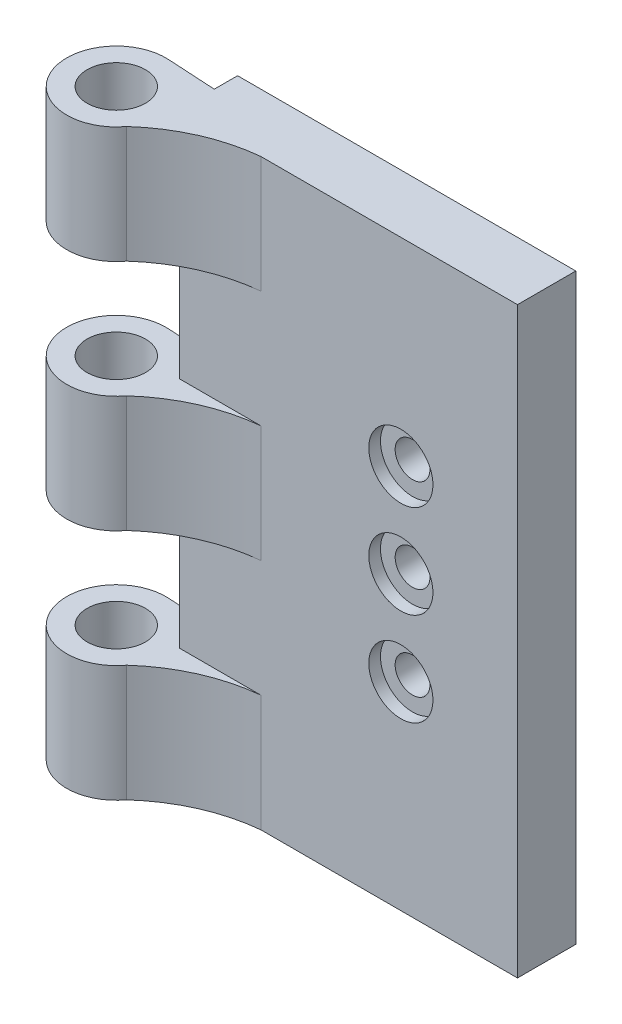
ISO-10303-21;
HEADER;
FILE_DESCRIPTION(('STEP AP214'),'2;1');
FILE_NAME('part.step','',(''),(''),'','','');
FILE_SCHEMA(('AUTOMOTIVE_DESIGN { 1 0 10303 214 1 1 1 1 }'));
ENDSEC;
DATA;
#1=APPLICATION_CONTEXT('core data for automotive mechanical design processes');
#2=APPLICATION_PROTOCOL_DEFINITION('international standard','automotive_design',2000,#1);
#3=PRODUCT_CONTEXT('',#1,'mechanical');
#4=PRODUCT('Part','Part','',(#3));
#5=PRODUCT_RELATED_PRODUCT_CATEGORY('part','',(#4));
#6=PRODUCT_DEFINITION_FORMATION('','',#4);
#7=PRODUCT_DEFINITION_CONTEXT('part definition',#1,'design');
#8=PRODUCT_DEFINITION('design','',#6,#7);
#9=PRODUCT_DEFINITION_SHAPE('','',#8);
#10=(LENGTH_UNIT() NAMED_UNIT(*) SI_UNIT(.MILLI.,.METRE.));
#11=(NAMED_UNIT(*) PLANE_ANGLE_UNIT() SI_UNIT($,.RADIAN.));
#12=(NAMED_UNIT(*) SI_UNIT($,.STERADIAN.) SOLID_ANGLE_UNIT());
#13=UNCERTAINTY_MEASURE_WITH_UNIT(LENGTH_MEASURE(1.E-05),#10,'distance_accuracy_value','');
#14=(GEOMETRIC_REPRESENTATION_CONTEXT(3) GLOBAL_UNCERTAINTY_ASSIGNED_CONTEXT((#13)) GLOBAL_UNIT_ASSIGNED_CONTEXT((#10,
#11,#12)) REPRESENTATION_CONTEXT('',''));
#15=CARTESIAN_POINT('',(0.,0.,0.));
#16=DIRECTION('',(0.,0.,1.));
#17=DIRECTION('',(1.,0.,0.));
#18=AXIS2_PLACEMENT_3D('',#15,#16,#17);
#19=CARTESIAN_POINT('',(27.5,-50.,0.));
#20=DIRECTION('',(0.,0.,-1.));
#21=DIRECTION('',(1.,0.,0.));
#22=AXIS2_PLACEMENT_3D('',#19,#20,#21);
#23=PLANE('',#22);
#24=CARTESIAN_POINT('',(29.,-33.,0.));
#25=DIRECTION('',(0.,0.,1.));
#26=DIRECTION('',(1.,0.,0.));
#27=AXIS2_PLACEMENT_3D('',#24,#25,#26);
#28=CIRCLE('',#27,2.75);
#29=CARTESIAN_POINT('',(31.75,-33.,0.));
#30=VERTEX_POINT('',#29);
#31=EDGE_CURVE('E10',#30,#30,#28,.T.);
#32=ORIENTED_EDGE('',*,*,#31,.F.);
#33=EDGE_LOOP('',(#32));
#34=FACE_BOUND('',#33,.T.);
#35=CARTESIAN_POINT('',(29.,-25.,0.));
#36=DIRECTION('',(0.,0.,1.));
#37=DIRECTION('',(1.,0.,0.));
#38=AXIS2_PLACEMENT_3D('',#35,#36,#37);
#39=CIRCLE('',#38,2.75);
#40=CARTESIAN_POINT('',(31.75,-25.,0.));
#41=VERTEX_POINT('',#40);
#42=EDGE_CURVE('E23',#41,#41,#39,.T.);
#43=ORIENTED_EDGE('',*,*,#42,.F.);
#44=EDGE_LOOP('',(#43));
#45=FACE_BOUND('',#44,.T.);
#46=CARTESIAN_POINT('',(29.,-17.,0.));
#47=DIRECTION('',(0.,0.,1.));
#48=DIRECTION('',(1.,0.,0.));
#49=AXIS2_PLACEMENT_3D('',#46,#47,#48);
#50=CIRCLE('',#49,2.75);
#51=CARTESIAN_POINT('',(31.75,-17.,0.));
#52=VERTEX_POINT('',#51);
#53=EDGE_CURVE('E284',#52,#52,#50,.T.);
#54=ORIENTED_EDGE('',*,*,#53,.F.);
#55=EDGE_LOOP('',(#54));
#56=FACE_BOUND('',#55,.T.);
#57=DIRECTION('',(0.,-1.,0.));
#58=VECTOR('',#57,1.);
#59=CARTESIAN_POINT('',(39.,-25.,0.));
#60=LINE('',#59,#58);
#61=CARTESIAN_POINT('',(39.,0.,0.));
#62=VERTEX_POINT('',#61);
#63=CARTESIAN_POINT('',(39.,-50.,0.));
#64=VERTEX_POINT('',#63);
#65=EDGE_CURVE('E30',#62,#64,#60,.T.);
#66=ORIENTED_EDGE('',*,*,#65,.F.);
#67=DIRECTION('',(1.,0.,0.));
#68=VECTOR('',#67,1.);
#69=CARTESIAN_POINT('',(27.5,0.,0.));
#70=LINE('',#69,#68);
#71=CARTESIAN_POINT('',(17.,0.,0.));
#72=VERTEX_POINT('',#71);
#73=EDGE_CURVE('E34',#72,#62,#70,.T.);
#74=ORIENTED_EDGE('',*,*,#73,.F.);
#75=DIRECTION('',(0.,-1.,0.));
#76=VECTOR('',#75,1.);
#77=CARTESIAN_POINT('',(17.,0.,0.));
#78=LINE('',#77,#76);
#79=CARTESIAN_POINT('',(17.,-10.,0.));
#80=VERTEX_POINT('',#79);
#81=EDGE_CURVE('E280',#72,#80,#78,.T.);
#82=ORIENTED_EDGE('',*,*,#81,.T.);
#83=DIRECTION('',(-1.,0.,0.));
#84=VECTOR('',#83,1.);
#85=CARTESIAN_POINT('',(13.5,-10.,0.));
#86=LINE('',#85,#84);
#87=CARTESIAN_POINT('',(10.,-10.,0.));
#88=VERTEX_POINT('',#87);
#89=EDGE_CURVE('E220',#80,#88,#86,.T.);
#90=ORIENTED_EDGE('',*,*,#89,.T.);
#91=DIRECTION('',(0.,-1.,0.));
#92=VECTOR('',#91,1.);
#93=CARTESIAN_POINT('',(10.,-50.,0.));
#94=LINE('',#93,#92);
#95=CARTESIAN_POINT('',(10.,-20.,0.));
#96=VERTEX_POINT('',#95);
#97=EDGE_CURVE('E277',#88,#96,#94,.T.);
#98=ORIENTED_EDGE('',*,*,#97,.T.);
#99=DIRECTION('',(-1.,0.,0.));
#100=VECTOR('',#99,1.);
#101=CARTESIAN_POINT('',(13.5,-20.,0.));
#102=LINE('',#101,#100);
#103=CARTESIAN_POINT('',(17.,-20.,0.));
#104=VERTEX_POINT('',#103);
#105=EDGE_CURVE('E274',#104,#96,#102,.T.);
#106=ORIENTED_EDGE('',*,*,#105,.F.);
#107=DIRECTION('',(0.,1.,0.));
#108=VECTOR('',#107,1.);
#109=CARTESIAN_POINT('',(17.,-30.,0.));
#110=LINE('',#109,#108);
#111=CARTESIAN_POINT('',(17.,-30.,0.));
#112=VERTEX_POINT('',#111);
#113=EDGE_CURVE('E271',#112,#104,#110,.T.);
#114=ORIENTED_EDGE('',*,*,#113,.F.);
#115=DIRECTION('',(-1.,0.,0.));
#116=VECTOR('',#115,1.);
#117=CARTESIAN_POINT('',(13.5,-30.,0.));
#118=LINE('',#117,#116);
#119=CARTESIAN_POINT('',(10.,-30.,0.));
#120=VERTEX_POINT('',#119);
#121=EDGE_CURVE('E269',#112,#120,#118,.T.);
#122=ORIENTED_EDGE('',*,*,#121,.T.);
#123=DIRECTION('',(0.,-1.,0.));
#124=VECTOR('',#123,1.);
#125=CARTESIAN_POINT('',(10.,-50.,0.));
#126=LINE('',#125,#124);
#127=CARTESIAN_POINT('',(10.,-40.,0.));
#128=VERTEX_POINT('',#127);
#129=EDGE_CURVE('E267',#120,#128,#126,.T.);
#130=ORIENTED_EDGE('',*,*,#129,.T.);
#131=DIRECTION('',(1.,0.,0.));
#132=VECTOR('',#131,1.);
#133=CARTESIAN_POINT('',(27.5,-40.,0.));
#134=LINE('',#133,#132);
#135=CARTESIAN_POINT('',(17.,-40.,0.));
#136=VERTEX_POINT('',#135);
#137=EDGE_CURVE('E152',#128,#136,#134,.T.);
#138=ORIENTED_EDGE('',*,*,#137,.T.);
#139=DIRECTION('',(0.,-1.,0.));
#140=VECTOR('',#139,1.);
#141=CARTESIAN_POINT('',(17.,-40.,0.));
#142=LINE('',#141,#140);
#143=CARTESIAN_POINT('',(17.,-50.,0.));
#144=VERTEX_POINT('',#143);
#145=EDGE_CURVE('E264',#136,#144,#142,.T.);
#146=ORIENTED_EDGE('',*,*,#145,.T.);
#147=DIRECTION('',(1.,0.,0.));
#148=VECTOR('',#147,1.);
#149=CARTESIAN_POINT('',(27.5,-50.,0.));
#150=LINE('',#149,#148);
#151=EDGE_CURVE('E262',#144,#64,#150,.T.);
#152=ORIENTED_EDGE('',*,*,#151,.T.);
#153=EDGE_LOOP('',(#66,#74,#82,#90,#98,#106,#114,#122,#130,#138,#146,#152));
#154=FACE_BOUND('',#153,.T.);
#155=ADVANCED_FACE('F16',(#34,#45,#56,#154),#23,.F.);
#156=CARTESIAN_POINT('',(23.175,-50.,1.));
#157=DIRECTION('',(0.,-1.,0.));
#158=DIRECTION('',(-1.,0.,0.));
#159=AXIS2_PLACEMENT_3D('',#156,#157,#158);
#160=PLANE('',#159);
#161=CARTESIAN_POINT('',(5.6,-50.,1.));
#162=DIRECTION('',(0.,1.,0.));
#163=DIRECTION('',(0.,0.,-1.));
#164=AXIS2_PLACEMENT_3D('',#161,#162,#163);
#165=CIRCLE('',#164,2.5);
#166=CARTESIAN_POINT('',(5.6,-50.,-1.5));
#167=VERTEX_POINT('',#166);
#168=EDGE_CURVE('E259',#167,#167,#165,.T.);
#169=ORIENTED_EDGE('',*,*,#168,.T.);
#170=EDGE_LOOP('',(#169));
#171=FACE_BOUND('',#170,.T.);
#172=DIRECTION('',(-0.998295131357138,0.,-0.0583680624026018));
#173=VECTOR('',#172,1.);
#174=CARTESIAN_POINT('',(7.92403213260554,-50.,-3.12137715413392));
#175=LINE('',#174,#173);
#176=CARTESIAN_POINT('',(10.,-50.,-3.));
#177=VERTEX_POINT('',#176);
#178=CARTESIAN_POINT('',(5.84806426521106,-50.,-3.24275430826784));
#179=VERTEX_POINT('',#178);
#180=EDGE_CURVE('E257',#177,#179,#175,.T.);
#181=ORIENTED_EDGE('',*,*,#180,.F.);
#182=DIRECTION('',(0.,0.,1.));
#183=VECTOR('',#182,1.);
#184=CARTESIAN_POINT('',(10.,-50.,-5.));
#185=LINE('',#184,#183);
#186=CARTESIAN_POINT('',(10.,-50.,-5.));
#187=VERTEX_POINT('',#186);
#188=EDGE_CURVE('E161',#187,#177,#185,.T.);
#189=ORIENTED_EDGE('',*,*,#188,.F.);
#190=DIRECTION('',(-1.,0.,0.));
#191=VECTOR('',#190,1.);
#192=CARTESIAN_POINT('',(27.5,-50.,-5.));
#193=LINE('',#192,#191);
#194=CARTESIAN_POINT('',(39.,-50.,-5.));
#195=VERTEX_POINT('',#194);
#196=EDGE_CURVE('E253',#195,#187,#193,.T.);
#197=ORIENTED_EDGE('',*,*,#196,.F.);
#198=DIRECTION('',(0.,0.,1.));
#199=VECTOR('',#198,1.);
#200=CARTESIAN_POINT('',(39.,-50.,-25.));
#201=LINE('',#200,#199);
#202=EDGE_CURVE('E250',#195,#64,#201,.T.);
#203=ORIENTED_EDGE('',*,*,#202,.T.);
#204=ORIENTED_EDGE('',*,*,#151,.F.);
#205=CARTESIAN_POINT('',(18.3700173067688,-50.,13.9004514734934));
#206=DIRECTION('',(0.,-1.,0.));
#207=DIRECTION('',(0.,0.,-1.));
#208=AXIS2_PLACEMENT_3D('',#205,#206,#207);
#209=CIRCLE('',#208,13.9678022103619);
#210=CARTESIAN_POINT('',(9.01867465020404,-50.,3.52490863914959));
#211=VERTEX_POINT('',#210);
#212=EDGE_CURVE('E247',#211,#144,#209,.T.);
#213=ORIENTED_EDGE('',*,*,#212,.F.);
#214=CARTESIAN_POINT('',(5.6,-50.,1.));
#215=DIRECTION('',(0.,1.,0.));
#216=DIRECTION('',(0.,0.,-1.));
#217=AXIS2_PLACEMENT_3D('',#214,#215,#216);
#218=CIRCLE('',#217,4.25);
#219=EDGE_CURVE('E244',#179,#211,#218,.T.);
#220=ORIENTED_EDGE('',*,*,#219,.F.);
#221=EDGE_LOOP('',(#181,#189,#197,#203,#204,#213,#220));
#222=FACE_BOUND('',#221,.T.);
#223=ADVANCED_FACE('F293',(#171,#222),#160,.T.);
#224=CARTESIAN_POINT('',(23.175,0.,1.));
#225=DIRECTION('',(0.,-1.,0.));
#226=DIRECTION('',(-1.,0.,0.));
#227=AXIS2_PLACEMENT_3D('',#224,#225,#226);
#228=PLANE('',#227);
#229=CARTESIAN_POINT('',(5.6,0.,1.));
#230=DIRECTION('',(0.,1.,0.));
#231=DIRECTION('',(0.,0.,-1.));
#232=AXIS2_PLACEMENT_3D('',#229,#230,#231);
#233=CIRCLE('',#232,2.5);
#234=CARTESIAN_POINT('',(5.6,0.,-1.5));
#235=VERTEX_POINT('',#234);
#236=EDGE_CURVE('E241',#235,#235,#233,.T.);
#237=ORIENTED_EDGE('',*,*,#236,.F.);
#238=EDGE_LOOP('',(#237));
#239=FACE_BOUND('',#238,.T.);
#240=DIRECTION('',(0.,0.,1.));
#241=VECTOR('',#240,1.);
#242=CARTESIAN_POINT('',(39.,0.,-25.));
#243=LINE('',#242,#241);
#244=CARTESIAN_POINT('',(39.,0.,-5.));
#245=VERTEX_POINT('',#244);
#246=EDGE_CURVE('E238',#245,#62,#243,.T.);
#247=ORIENTED_EDGE('',*,*,#246,.F.);
#248=DIRECTION('',(-1.,0.,0.));
#249=VECTOR('',#248,1.);
#250=CARTESIAN_POINT('',(27.5,0.,-5.));
#251=LINE('',#250,#249);
#252=CARTESIAN_POINT('',(10.,0.,-5.));
#253=VERTEX_POINT('',#252);
#254=EDGE_CURVE('E236',#245,#253,#251,.T.);
#255=ORIENTED_EDGE('',*,*,#254,.T.);
#256=DIRECTION('',(0.,0.,1.));
#257=VECTOR('',#256,1.);
#258=CARTESIAN_POINT('',(10.,0.,-5.));
#259=LINE('',#258,#257);
#260=CARTESIAN_POINT('',(10.,0.,-3.));
#261=VERTEX_POINT('',#260);
#262=EDGE_CURVE('E234',#253,#261,#259,.T.);
#263=ORIENTED_EDGE('',*,*,#262,.T.);
#264=DIRECTION('',(-0.998295131357138,0.,-0.0583680624026018));
#265=VECTOR('',#264,1.);
#266=CARTESIAN_POINT('',(7.92403213260554,0.,-3.12137715413392));
#267=LINE('',#266,#265);
#268=CARTESIAN_POINT('',(5.84806426521106,0.,-3.24275430826784));
#269=VERTEX_POINT('',#268);
#270=EDGE_CURVE('E232',#261,#269,#267,.T.);
#271=ORIENTED_EDGE('',*,*,#270,.T.);
#272=CARTESIAN_POINT('',(5.6,0.,1.));
#273=DIRECTION('',(0.,1.,0.));
#274=DIRECTION('',(0.,0.,-1.));
#275=AXIS2_PLACEMENT_3D('',#272,#273,#274);
#276=CIRCLE('',#275,4.25);
#277=CARTESIAN_POINT('',(9.01867485575821,0.,3.52490836083343));
#278=VERTEX_POINT('',#277);
#279=EDGE_CURVE('E228',#269,#278,#276,.T.);
#280=ORIENTED_EDGE('',*,*,#279,.T.);
#281=CARTESIAN_POINT('',(18.3700162508407,0.,13.9004493564932));
#282=DIRECTION('',(0.,-1.,0.));
#283=DIRECTION('',(1.,0.,0.));
#284=AXIS2_PLACEMENT_3D('',#281,#282,#283);
#285=CIRCLE('',#284,13.9678);
#286=EDGE_CURVE('E227',#278,#72,#285,.T.);
#287=ORIENTED_EDGE('',*,*,#286,.T.);
#288=ORIENTED_EDGE('',*,*,#73,.T.);
#289=EDGE_LOOP('',(#247,#255,#263,#271,#280,#287,#288));
#290=FACE_BOUND('',#289,.T.);
#291=ADVANCED_FACE('F366',(#239,#290),#228,.F.);
#292=CARTESIAN_POINT('',(5.6,-50.,1.));
#293=DIRECTION('',(0.,1.,0.));
#294=DIRECTION('',(0.,0.,1.));
#295=AXIS2_PLACEMENT_3D('',#292,#293,#294);
#296=CYLINDRICAL_SURFACE('',#295,4.25);
#297=DIRECTION('',(0.,-1.,0.));
#298=VECTOR('',#297,1.);
#299=CARTESIAN_POINT('',(9.01867485575821,0.,3.52490836083343));
#300=LINE('',#299,#298);
#301=CARTESIAN_POINT('',(9.01867485575821,-10.,3.52490836083343));
#302=VERTEX_POINT('',#301);
#303=EDGE_CURVE('E199',#278,#302,#300,.T.);
#304=ORIENTED_EDGE('',*,*,#303,.F.);
#305=ORIENTED_EDGE('',*,*,#279,.F.);
#306=DIRECTION('',(0.,1.,0.));
#307=VECTOR('',#306,1.);
#308=CARTESIAN_POINT('',(5.84806426521106,-50.,-3.24275430826784));
#309=LINE('',#308,#307);
#310=CARTESIAN_POINT('',(5.84806426521106,-10.,-3.24275430826783));
#311=VERTEX_POINT('',#310);
#312=EDGE_CURVE('E195',#311,#269,#309,.T.);
#313=ORIENTED_EDGE('',*,*,#312,.F.);
#314=CARTESIAN_POINT('',(5.6,-10.,1.));
#315=DIRECTION('',(0.,1.,0.));
#316=DIRECTION('',(-1.,0.,0.));
#317=AXIS2_PLACEMENT_3D('',#314,#315,#316);
#318=CIRCLE('',#317,4.25);
#319=EDGE_CURVE('E200',#311,#302,#318,.T.);
#320=ORIENTED_EDGE('',*,*,#319,.T.);
#321=EDGE_LOOP('',(#304,#305,#313,#320));
#322=FACE_BOUND('',#321,.T.);
#323=ADVANCED_FACE('F209',(#322),#296,.T.);
#324=DIRECTION('',(0.,-1.,0.));
#325=VECTOR('',#324,1.);
#326=CARTESIAN_POINT('',(9.01867465020404,-40.,3.52490863914959));
#327=LINE('',#326,#325);
#328=CARTESIAN_POINT('',(9.01867465020404,-40.,3.52490863914959));
#329=VERTEX_POINT('',#328);
#330=EDGE_CURVE('E202',#329,#211,#327,.T.);
#331=ORIENTED_EDGE('',*,*,#330,.F.);
#332=CARTESIAN_POINT('',(5.6,-40.,1.));
#333=DIRECTION('',(0.,-1.,0.));
#334=DIRECTION('',(0.,0.,-1.));
#335=AXIS2_PLACEMENT_3D('',#332,#333,#334);
#336=CIRCLE('',#335,4.25);
#337=CARTESIAN_POINT('',(5.84806426521106,-40.,-3.24275430826784));
#338=VERTEX_POINT('',#337);
#339=EDGE_CURVE('E201',#329,#338,#336,.T.);
#340=ORIENTED_EDGE('',*,*,#339,.T.);
#341=EDGE_CURVE('E141',#179,#338,#309,.T.);
#342=ORIENTED_EDGE('',*,*,#341,.F.);
#343=ORIENTED_EDGE('',*,*,#219,.T.);
#344=EDGE_LOOP('',(#331,#340,#342,#343));
#345=FACE_BOUND('',#344,.T.);
#346=ADVANCED_FACE('F365',(#345),#296,.T.);
#347=CARTESIAN_POINT('',(7.92403213260554,-50.,-3.12137715413392));
#348=DIRECTION('',(-0.0583680624026018,0.,0.998295131357138));
#349=DIRECTION('',(-0.998295131357138,0.,-0.0583680624026018));
#350=AXIS2_PLACEMENT_3D('',#347,#348,#349);
#351=PLANE('',#350);
#352=DIRECTION('',(0.,1.,0.));
#353=VECTOR('',#352,1.);
#354=CARTESIAN_POINT('',(10.,-50.,-3.));
#355=LINE('',#354,#353);
#356=CARTESIAN_POINT('',(10.,-10.,-3.));
#357=VERTEX_POINT('',#356);
#358=EDGE_CURVE('E164',#357,#261,#355,.T.);
#359=ORIENTED_EDGE('',*,*,#358,.F.);
#360=DIRECTION('',(-0.998295131357138,0.,-0.0583680624026018));
#361=VECTOR('',#360,1.);
#362=CARTESIAN_POINT('',(7.92403213260554,-10.,-3.12137715413392));
#363=LINE('',#362,#361);
#364=EDGE_CURVE('E172',#357,#311,#363,.T.);
#365=ORIENTED_EDGE('',*,*,#364,.T.);
#366=ORIENTED_EDGE('',*,*,#312,.T.);
#367=ORIENTED_EDGE('',*,*,#270,.F.);
#368=EDGE_LOOP('',(#359,#365,#366,#367));
#369=FACE_BOUND('',#368,.T.);
#370=ADVANCED_FACE('F359',(#369),#351,.F.);
#371=CARTESIAN_POINT('',(5.84806426521106,-30.,-3.24275430826783));
#372=VERTEX_POINT('',#371);
#373=CARTESIAN_POINT('',(5.84806426521106,-20.,-3.24275430826784));
#374=VERTEX_POINT('',#373);
#375=EDGE_CURVE('E179',#372,#374,#309,.T.);
#376=ORIENTED_EDGE('',*,*,#375,.T.);
#377=DIRECTION('',(0.998295131357138,0.,0.0583680624026018));
#378=VECTOR('',#377,1.);
#379=CARTESIAN_POINT('',(7.92403213260554,-20.,-3.12137715413392));
#380=LINE('',#379,#378);
#381=CARTESIAN_POINT('',(10.,-20.,-3.));
#382=VERTEX_POINT('',#381);
#383=EDGE_CURVE('E174',#374,#382,#380,.T.);
#384=ORIENTED_EDGE('',*,*,#383,.T.);
#385=CARTESIAN_POINT('',(10.,-30.,-3.));
#386=VERTEX_POINT('',#385);
#387=EDGE_CURVE('E165',#386,#382,#355,.T.);
#388=ORIENTED_EDGE('',*,*,#387,.F.);
#389=DIRECTION('',(-0.998295131357138,0.,-0.0583680624026018));
#390=VECTOR('',#389,1.);
#391=CARTESIAN_POINT('',(7.92403213260554,-30.,-3.12137715413392));
#392=LINE('',#391,#390);
#393=EDGE_CURVE('E175',#386,#372,#392,.T.);
#394=ORIENTED_EDGE('',*,*,#393,.T.);
#395=EDGE_LOOP('',(#376,#384,#388,#394));
#396=FACE_BOUND('',#395,.T.);
#397=ADVANCED_FACE('F360',(#396),#351,.F.);
#398=CARTESIAN_POINT('',(5.6,-30.,1.));
#399=DIRECTION('',(0.,1.,0.));
#400=DIRECTION('',(-1.,0.,0.));
#401=AXIS2_PLACEMENT_3D('',#398,#399,#400);
#402=CIRCLE('',#401,4.25);
#403=CARTESIAN_POINT('',(9.0186748557582,-30.,3.52490836083344));
#404=VERTEX_POINT('',#403);
#405=EDGE_CURVE('E181',#372,#404,#402,.T.);
#406=ORIENTED_EDGE('',*,*,#405,.T.);
#407=DIRECTION('',(0.,1.,0.));
#408=VECTOR('',#407,1.);
#409=CARTESIAN_POINT('',(9.0186748557582,-30.,3.52490836083344));
#410=LINE('',#409,#408);
#411=CARTESIAN_POINT('',(9.0186748557582,-20.,3.52490836083344));
#412=VERTEX_POINT('',#411);
#413=EDGE_CURVE('E186',#404,#412,#410,.T.);
#414=ORIENTED_EDGE('',*,*,#413,.T.);
#415=CARTESIAN_POINT('',(5.6,-20.,1.));
#416=DIRECTION('',(0.,-1.,0.));
#417=DIRECTION('',(0.,0.,-1.));
#418=AXIS2_PLACEMENT_3D('',#415,#416,#417);
#419=CIRCLE('',#418,4.25);
#420=EDGE_CURVE('E616',#412,#374,#419,.T.);
#421=ORIENTED_EDGE('',*,*,#420,.T.);
#422=ORIENTED_EDGE('',*,*,#375,.F.);
#423=EDGE_LOOP('',(#406,#414,#421,#422));
#424=FACE_BOUND('',#423,.T.);
#425=ADVANCED_FACE('F361',(#424),#296,.T.);
#426=CARTESIAN_POINT('',(5.6,-50.,1.));
#427=DIRECTION('',(0.,1.,0.));
#428=DIRECTION('',(0.,0.,1.));
#429=AXIS2_PLACEMENT_3D('',#426,#427,#428);
#430=CYLINDRICAL_SURFACE('',#429,2.5);
#431=CARTESIAN_POINT('',(5.6,-10.,1.));
#432=DIRECTION('',(0.,1.,0.));
#433=DIRECTION('',(-1.,0.,0.));
#434=AXIS2_PLACEMENT_3D('',#431,#432,#433);
#435=CIRCLE('',#434,2.5);
#436=CARTESIAN_POINT('',(3.1,-10.,1.));
#437=VERTEX_POINT('',#436);
#438=EDGE_CURVE('E144',#437,#437,#435,.T.);
#439=ORIENTED_EDGE('',*,*,#438,.F.);
#440=EDGE_LOOP('',(#439));
#441=FACE_BOUND('',#440,.T.);
#442=ORIENTED_EDGE('',*,*,#236,.T.);
#443=EDGE_LOOP('',(#442));
#444=FACE_BOUND('',#443,.T.);
#445=ADVANCED_FACE('F356',(#441,#444),#430,.F.);
#446=ORIENTED_EDGE('',*,*,#341,.T.);
#447=DIRECTION('',(0.998295131357138,0.,0.0583680624026018));
#448=VECTOR('',#447,1.);
#449=CARTESIAN_POINT('',(7.92403213260554,-40.,-3.12137715413392));
#450=LINE('',#449,#448);
#451=CARTESIAN_POINT('',(10.,-40.,-3.));
#452=VERTEX_POINT('',#451);
#453=EDGE_CURVE('E133',#338,#452,#450,.T.);
#454=ORIENTED_EDGE('',*,*,#453,.T.);
#455=EDGE_CURVE('E138',#177,#452,#355,.T.);
#456=ORIENTED_EDGE('',*,*,#455,.F.);
#457=ORIENTED_EDGE('',*,*,#180,.T.);
#458=EDGE_LOOP('',(#446,#454,#456,#457));
#459=FACE_BOUND('',#458,.T.);
#460=ADVANCED_FACE('F135',(#459),#351,.F.);
#461=CARTESIAN_POINT('',(5.6,-40.,1.));
#462=DIRECTION('',(0.,-1.,0.));
#463=DIRECTION('',(0.,0.,-1.));
#464=AXIS2_PLACEMENT_3D('',#461,#462,#463);
#465=CIRCLE('',#464,2.5);
#466=CARTESIAN_POINT('',(5.6,-40.,-1.5));
#467=VERTEX_POINT('',#466);
#468=EDGE_CURVE('E162',#467,#467,#465,.T.);
#469=ORIENTED_EDGE('',*,*,#468,.F.);
#470=EDGE_LOOP('',(#469));
#471=FACE_BOUND('',#470,.T.);
#472=ORIENTED_EDGE('',*,*,#168,.F.);
#473=EDGE_LOOP('',(#472));
#474=FACE_BOUND('',#473,.T.);
#475=ADVANCED_FACE('F351',(#471,#474),#430,.F.);
#476=CARTESIAN_POINT('',(-3.49999999999995,-30.,-12.5));
#477=DIRECTION('',(0.,1.,0.));
#478=DIRECTION('',(-1.,0.,0.));
#479=AXIS2_PLACEMENT_3D('',#476,#477,#478);
#480=PLANE('',#479);
#481=DIRECTION('',(0.,0.,1.));
#482=VECTOR('',#481,1.);
#483=CARTESIAN_POINT('',(10.,-30.,-12.5));
#484=LINE('',#483,#482);
#485=EDGE_CURVE('E167',#386,#120,#484,.T.);
#486=ORIENTED_EDGE('',*,*,#485,.T.);
#487=ORIENTED_EDGE('',*,*,#121,.F.);
#488=CARTESIAN_POINT('',(18.3700162508407,-30.,13.9004493564932));
#489=DIRECTION('',(0.,1.,0.));
#490=DIRECTION('',(0.,0.,1.));
#491=AXIS2_PLACEMENT_3D('',#488,#489,#490);
#492=CIRCLE('',#491,13.9678);
#493=EDGE_CURVE('E609',#112,#404,#492,.T.);
#494=ORIENTED_EDGE('',*,*,#493,.T.);
#495=ORIENTED_EDGE('',*,*,#405,.F.);
#496=ORIENTED_EDGE('',*,*,#393,.F.);
#497=EDGE_LOOP('',(#486,#487,#494,#495,#496));
#498=FACE_BOUND('',#497,.T.);
#499=CARTESIAN_POINT('',(5.6,-30.,1.));
#500=DIRECTION('',(0.,1.,0.));
#501=DIRECTION('',(-1.,0.,0.));
#502=AXIS2_PLACEMENT_3D('',#499,#500,#501);
#503=CIRCLE('',#502,2.5);
#504=CARTESIAN_POINT('',(3.1,-30.,1.));
#505=VERTEX_POINT('',#504);
#506=EDGE_CURVE('E155',#505,#505,#503,.T.);
#507=ORIENTED_EDGE('',*,*,#506,.T.);
#508=EDGE_LOOP('',(#507));
#509=FACE_BOUND('',#508,.T.);
#510=ADVANCED_FACE('F348',(#498,#509),#480,.F.);
#511=CARTESIAN_POINT('',(-3.49999999999995,-40.,-12.5));
#512=DIRECTION('',(0.,-1.,0.));
#513=DIRECTION('',(0.,0.,-1.));
#514=AXIS2_PLACEMENT_3D('',#511,#512,#513);
#515=PLANE('',#514);
#516=ORIENTED_EDGE('',*,*,#137,.F.);
#517=DIRECTION('',(0.,0.,1.));
#518=VECTOR('',#517,1.);
#519=CARTESIAN_POINT('',(10.,-40.,-12.5));
#520=LINE('',#519,#518);
#521=EDGE_CURVE('E148',#452,#128,#520,.T.);
#522=ORIENTED_EDGE('',*,*,#521,.F.);
#523=ORIENTED_EDGE('',*,*,#453,.F.);
#524=ORIENTED_EDGE('',*,*,#339,.F.);
#525=CARTESIAN_POINT('',(18.3700173067688,-40.,13.9004514734934));
#526=DIRECTION('',(0.,-1.,0.));
#527=DIRECTION('',(0.,0.,-1.));
#528=AXIS2_PLACEMENT_3D('',#525,#526,#527);
#529=CIRCLE('',#528,13.9678022103619);
#530=EDGE_CURVE('E156',#329,#136,#529,.T.);
#531=ORIENTED_EDGE('',*,*,#530,.T.);
#532=EDGE_LOOP('',(#516,#522,#523,#524,#531));
#533=FACE_BOUND('',#532,.T.);
#534=ORIENTED_EDGE('',*,*,#468,.T.);
#535=EDGE_LOOP('',(#534));
#536=FACE_BOUND('',#535,.T.);
#537=ADVANCED_FACE('F149',(#533,#536),#515,.F.);
#538=CARTESIAN_POINT('',(5.6,-20.,1.));
#539=DIRECTION('',(0.,-1.,0.));
#540=DIRECTION('',(0.,0.,-1.));
#541=AXIS2_PLACEMENT_3D('',#538,#539,#540);
#542=CIRCLE('',#541,2.5);
#543=CARTESIAN_POINT('',(5.6,-20.,-1.5));
#544=VERTEX_POINT('',#543);
#545=EDGE_CURVE('E599',#544,#544,#542,.T.);
#546=ORIENTED_EDGE('',*,*,#545,.F.);
#547=EDGE_LOOP('',(#546));
#548=FACE_BOUND('',#547,.T.);
#549=ORIENTED_EDGE('',*,*,#506,.F.);
#550=EDGE_LOOP('',(#549));
#551=FACE_BOUND('',#550,.T.);
#552=ADVANCED_FACE('F345',(#548,#551),#430,.F.);
#553=CARTESIAN_POINT('',(10.,-50.,-12.5));
#554=DIRECTION('',(1.,0.,0.));
#555=DIRECTION('',(0.,0.,-1.));
#556=AXIS2_PLACEMENT_3D('',#553,#554,#555);
#557=PLANE('',#556);
#558=DIRECTION('',(0.,0.,1.));
#559=VECTOR('',#558,1.);
#560=CARTESIAN_POINT('',(10.,-10.,-12.5));
#561=LINE('',#560,#559);
#562=EDGE_CURVE('E598',#357,#88,#561,.T.);
#563=ORIENTED_EDGE('',*,*,#562,.F.);
#564=ORIENTED_EDGE('',*,*,#358,.T.);
#565=ORIENTED_EDGE('',*,*,#262,.F.);
#566=DIRECTION('',(0.,1.,0.));
#567=VECTOR('',#566,1.);
#568=CARTESIAN_POINT('',(10.,-50.,-5.));
#569=LINE('',#568,#567);
#570=EDGE_CURVE('E593',#187,#253,#569,.T.);
#571=ORIENTED_EDGE('',*,*,#570,.F.);
#572=ORIENTED_EDGE('',*,*,#188,.T.);
#573=ORIENTED_EDGE('',*,*,#455,.T.);
#574=ORIENTED_EDGE('',*,*,#521,.T.);
#575=ORIENTED_EDGE('',*,*,#129,.F.);
#576=ORIENTED_EDGE('',*,*,#485,.F.);
#577=ORIENTED_EDGE('',*,*,#387,.T.);
#578=DIRECTION('',(0.,0.,1.));
#579=VECTOR('',#578,1.);
#580=CARTESIAN_POINT('',(10.,-20.,-12.5));
#581=LINE('',#580,#579);
#582=EDGE_CURVE('E223',#382,#96,#581,.T.);
#583=ORIENTED_EDGE('',*,*,#582,.T.);
#584=ORIENTED_EDGE('',*,*,#97,.F.);
#585=EDGE_LOOP('',(#563,#564,#565,#571,#572,#573,#574,#575,#576,#577,#583,#584));
#586=FACE_BOUND('',#585,.T.);
#587=ADVANCED_FACE('F159',(#586),#557,.F.);
#588=CARTESIAN_POINT('',(-3.49999999999995,-10.,-12.5));
#589=DIRECTION('',(0.,1.,0.));
#590=DIRECTION('',(-1.,0.,0.));
#591=AXIS2_PLACEMENT_3D('',#588,#589,#590);
#592=PLANE('',#591);
#593=ORIENTED_EDGE('',*,*,#562,.T.);
#594=ORIENTED_EDGE('',*,*,#89,.F.);
#595=CARTESIAN_POINT('',(18.3700162508407,-10.,13.9004493564932));
#596=DIRECTION('',(0.,-1.,0.));
#597=DIRECTION('',(1.,0.,0.));
#598=AXIS2_PLACEMENT_3D('',#595,#596,#597);
#599=CIRCLE('',#598,13.9678);
#600=EDGE_CURVE('E216',#302,#80,#599,.T.);
#601=ORIENTED_EDGE('',*,*,#600,.F.);
#602=ORIENTED_EDGE('',*,*,#319,.F.);
#603=ORIENTED_EDGE('',*,*,#364,.F.);
#604=EDGE_LOOP('',(#593,#594,#601,#602,#603));
#605=FACE_BOUND('',#604,.T.);
#606=ORIENTED_EDGE('',*,*,#438,.T.);
#607=EDGE_LOOP('',(#606));
#608=FACE_BOUND('',#607,.T.);
#609=ADVANCED_FACE('F218',(#605,#608),#592,.F.);
#610=CARTESIAN_POINT('',(-3.49999999999995,-20.,-12.5));
#611=DIRECTION('',(0.,-1.,0.));
#612=DIRECTION('',(0.,0.,-1.));
#613=AXIS2_PLACEMENT_3D('',#610,#611,#612);
#614=PLANE('',#613);
#615=ORIENTED_EDGE('',*,*,#105,.T.);
#616=ORIENTED_EDGE('',*,*,#582,.F.);
#617=ORIENTED_EDGE('',*,*,#383,.F.);
#618=ORIENTED_EDGE('',*,*,#420,.F.);
#619=CARTESIAN_POINT('',(18.3700162508407,-20.,13.9004493564932));
#620=DIRECTION('',(0.,1.,0.));
#621=DIRECTION('',(0.,0.,1.));
#622=AXIS2_PLACEMENT_3D('',#619,#620,#621);
#623=CIRCLE('',#622,13.9678);
#624=EDGE_CURVE('E224',#104,#412,#623,.T.);
#625=ORIENTED_EDGE('',*,*,#624,.F.);
#626=EDGE_LOOP('',(#615,#616,#617,#618,#625));
#627=FACE_BOUND('',#626,.T.);
#628=ORIENTED_EDGE('',*,*,#545,.T.);
#629=EDGE_LOOP('',(#628));
#630=FACE_BOUND('',#629,.T.);
#631=ADVANCED_FACE('F336',(#627,#630),#614,.F.);
#632=CARTESIAN_POINT('',(18.3700173067688,-40.,13.9004514734934));
#633=DIRECTION('',(0.,-1.,0.));
#634=DIRECTION('',(0.,0.,-1.));
#635=AXIS2_PLACEMENT_3D('',#632,#633,#634);
#636=CYLINDRICAL_SURFACE('',#635,13.9678022103619);
#637=ORIENTED_EDGE('',*,*,#212,.T.);
#638=ORIENTED_EDGE('',*,*,#145,.F.);
#639=ORIENTED_EDGE('',*,*,#530,.F.);
#640=ORIENTED_EDGE('',*,*,#330,.T.);
#641=EDGE_LOOP('',(#637,#638,#639,#640));
#642=FACE_BOUND('',#641,.T.);
#643=ADVANCED_FACE('F333',(#642),#636,.F.);
#644=CARTESIAN_POINT('',(18.3700162508407,0.,13.9004493564932));
#645=DIRECTION('',(0.,-1.,0.));
#646=DIRECTION('',(1.,0.,0.));
#647=AXIS2_PLACEMENT_3D('',#644,#645,#646);
#648=CYLINDRICAL_SURFACE('',#647,13.9678);
#649=ORIENTED_EDGE('',*,*,#600,.T.);
#650=ORIENTED_EDGE('',*,*,#81,.F.);
#651=ORIENTED_EDGE('',*,*,#286,.F.);
#652=ORIENTED_EDGE('',*,*,#303,.T.);
#653=EDGE_LOOP('',(#649,#650,#651,#652));
#654=FACE_BOUND('',#653,.T.);
#655=ADVANCED_FACE('F226',(#654),#648,.F.);
#656=CARTESIAN_POINT('',(18.3700162508407,-30.,13.9004493564932));
#657=DIRECTION('',(0.,1.,0.));
#658=DIRECTION('',(0.,0.,1.));
#659=AXIS2_PLACEMENT_3D('',#656,#657,#658);
#660=CYLINDRICAL_SURFACE('',#659,13.9678);
#661=ORIENTED_EDGE('',*,*,#624,.T.);
#662=ORIENTED_EDGE('',*,*,#413,.F.);
#663=ORIENTED_EDGE('',*,*,#493,.F.);
#664=ORIENTED_EDGE('',*,*,#113,.T.);
#665=EDGE_LOOP('',(#661,#662,#663,#664));
#666=FACE_BOUND('',#665,.T.);
#667=ADVANCED_FACE('F326',(#666),#660,.F.);
#668=CARTESIAN_POINT('',(29.,-33.,-1.));
#669=DIRECTION('',(0.,0.,1.));
#670=DIRECTION('',(1.,0.,0.));
#671=AXIS2_PLACEMENT_3D('',#668,#669,#670);
#672=CYLINDRICAL_SURFACE('',#671,2.75);
#673=CARTESIAN_POINT('',(29.,-33.,-1.));
#674=DIRECTION('',(0.,0.,1.));
#675=DIRECTION('',(1.,0.,0.));
#676=AXIS2_PLACEMENT_3D('',#673,#674,#675);
#677=CIRCLE('',#676,2.75);
#678=CARTESIAN_POINT('',(31.75,-33.,-1.));
#679=VERTEX_POINT('',#678);
#680=EDGE_CURVE('E625',#679,#679,#677,.T.);
#681=ORIENTED_EDGE('',*,*,#680,.F.);
#682=EDGE_LOOP('',(#681));
#683=FACE_BOUND('',#682,.T.);
#684=ORIENTED_EDGE('',*,*,#31,.T.);
#685=EDGE_LOOP('',(#684));
#686=FACE_BOUND('',#685,.T.);
#687=ADVANCED_FACE('F322',(#683,#686),#672,.F.);
#688=CARTESIAN_POINT('',(27.5,-25.,-1.));
#689=DIRECTION('',(0.,0.,1.));
#690=DIRECTION('',(1.,0.,0.));
#691=AXIS2_PLACEMENT_3D('',#688,#689,#690);
#692=PLANE('',#691);
#693=CARTESIAN_POINT('',(29.,-33.,-1.));
#694=DIRECTION('',(0.,0.,1.));
#695=DIRECTION('',(1.,0.,0.));
#696=AXIS2_PLACEMENT_3D('',#693,#694,#695);
#697=CIRCLE('',#696,1.49);
#698=CARTESIAN_POINT('',(30.49,-33.,-1.));
#699=VERTEX_POINT('',#698);
#700=EDGE_CURVE('E628',#699,#699,#697,.T.);
#701=ORIENTED_EDGE('',*,*,#700,.F.);
#702=EDGE_LOOP('',(#701));
#703=FACE_BOUND('',#702,.T.);
#704=ORIENTED_EDGE('',*,*,#680,.T.);
#705=EDGE_LOOP('',(#704));
#706=FACE_BOUND('',#705,.T.);
#707=ADVANCED_FACE('F318',(#703,#706),#692,.T.);
#708=CARTESIAN_POINT('',(29.,-25.,-1.));
#709=DIRECTION('',(0.,0.,1.));
#710=DIRECTION('',(1.,0.,0.));
#711=AXIS2_PLACEMENT_3D('',#708,#709,#710);
#712=CYLINDRICAL_SURFACE('',#711,2.75);
#713=CARTESIAN_POINT('',(29.,-25.,-1.));
#714=DIRECTION('',(0.,0.,1.));
#715=DIRECTION('',(1.,0.,0.));
#716=AXIS2_PLACEMENT_3D('',#713,#714,#715);
#717=CIRCLE('',#716,2.75);
#718=CARTESIAN_POINT('',(31.75,-25.,-1.));
#719=VERTEX_POINT('',#718);
#720=EDGE_CURVE('E633',#719,#719,#717,.T.);
#721=ORIENTED_EDGE('',*,*,#720,.F.);
#722=EDGE_LOOP('',(#721));
#723=FACE_BOUND('',#722,.T.);
#724=ORIENTED_EDGE('',*,*,#42,.T.);
#725=EDGE_LOOP('',(#724));
#726=FACE_BOUND('',#725,.T.);
#727=ADVANCED_FACE('F289',(#723,#726),#712,.F.);
#728=CARTESIAN_POINT('',(27.5,-25.,-1.));
#729=DIRECTION('',(0.,0.,1.));
#730=DIRECTION('',(1.,0.,0.));
#731=AXIS2_PLACEMENT_3D('',#728,#729,#730);
#732=PLANE('',#731);
#733=CARTESIAN_POINT('',(29.,-25.,-1.));
#734=DIRECTION('',(0.,0.,1.));
#735=DIRECTION('',(1.,0.,0.));
#736=AXIS2_PLACEMENT_3D('',#733,#734,#735);
#737=CIRCLE('',#736,1.49);
#738=CARTESIAN_POINT('',(30.49,-25.,-1.));
#739=VERTEX_POINT('',#738);
#740=EDGE_CURVE('E636',#739,#739,#737,.T.);
#741=ORIENTED_EDGE('',*,*,#740,.F.);
#742=EDGE_LOOP('',(#741));
#743=FACE_BOUND('',#742,.T.);
#744=ORIENTED_EDGE('',*,*,#720,.T.);
#745=EDGE_LOOP('',(#744));
#746=FACE_BOUND('',#745,.T.);
#747=ADVANCED_FACE('F300',(#743,#746),#732,.T.);
#748=CARTESIAN_POINT('',(29.,-17.,-1.));
#749=DIRECTION('',(0.,0.,1.));
#750=DIRECTION('',(1.,0.,0.));
#751=AXIS2_PLACEMENT_3D('',#748,#749,#750);
#752=CYLINDRICAL_SURFACE('',#751,2.75);
#753=CARTESIAN_POINT('',(29.,-17.,-1.));
#754=DIRECTION('',(0.,0.,1.));
#755=DIRECTION('',(1.,0.,0.));
#756=AXIS2_PLACEMENT_3D('',#753,#754,#755);
#757=CIRCLE('',#756,2.75);
#758=CARTESIAN_POINT('',(31.75,-17.,-1.));
#759=VERTEX_POINT('',#758);
#760=EDGE_CURVE('E639',#759,#759,#757,.T.);
#761=ORIENTED_EDGE('',*,*,#760,.F.);
#762=EDGE_LOOP('',(#761));
#763=FACE_BOUND('',#762,.T.);
#764=ORIENTED_EDGE('',*,*,#53,.T.);
#765=EDGE_LOOP('',(#764));
#766=FACE_BOUND('',#765,.T.);
#767=ADVANCED_FACE('F297',(#763,#766),#752,.F.);
#768=CARTESIAN_POINT('',(27.5,-25.,-1.));
#769=DIRECTION('',(0.,0.,1.));
#770=DIRECTION('',(1.,0.,0.));
#771=AXIS2_PLACEMENT_3D('',#768,#769,#770);
#772=PLANE('',#771);
#773=CARTESIAN_POINT('',(29.,-17.,-1.));
#774=DIRECTION('',(0.,0.,1.));
#775=DIRECTION('',(1.,0.,0.));
#776=AXIS2_PLACEMENT_3D('',#773,#774,#775);
#777=CIRCLE('',#776,1.49);
#778=CARTESIAN_POINT('',(30.49,-17.,-1.));
#779=VERTEX_POINT('',#778);
#780=EDGE_CURVE('E642',#779,#779,#777,.T.);
#781=ORIENTED_EDGE('',*,*,#780,.F.);
#782=EDGE_LOOP('',(#781));
#783=FACE_BOUND('',#782,.T.);
#784=ORIENTED_EDGE('',*,*,#760,.T.);
#785=EDGE_LOOP('',(#784));
#786=FACE_BOUND('',#785,.T.);
#787=ADVANCED_FACE('F299',(#783,#786),#772,.T.);
#788=CARTESIAN_POINT('',(29.,-17.,-3.));
#789=DIRECTION('',(0.,0.,1.));
#790=DIRECTION('',(1.,0.,0.));
#791=AXIS2_PLACEMENT_3D('',#788,#789,#790);
#792=CYLINDRICAL_SURFACE('',#791,1.49);
#793=ORIENTED_EDGE('',*,*,#780,.T.);
#794=EDGE_LOOP('',(#793));
#795=FACE_BOUND('',#794,.T.);
#796=CARTESIAN_POINT('',(29.,-17.,-5.));
#797=DIRECTION('',(0.,0.,1.));
#798=DIRECTION('',(1.,0.,0.));
#799=AXIS2_PLACEMENT_3D('',#796,#797,#798);
#800=CIRCLE('',#799,1.49);
#801=CARTESIAN_POINT('',(30.49,-17.,-5.));
#802=VERTEX_POINT('',#801);
#803=EDGE_CURVE('E579',#802,#802,#800,.T.);
#804=ORIENTED_EDGE('',*,*,#803,.F.);
#805=EDGE_LOOP('',(#804));
#806=FACE_BOUND('',#805,.T.);
#807=ADVANCED_FACE('F308',(#795,#806),#792,.F.);
#808=CARTESIAN_POINT('',(29.,-25.,-3.));
#809=DIRECTION('',(0.,0.,1.));
#810=DIRECTION('',(1.,0.,0.));
#811=AXIS2_PLACEMENT_3D('',#808,#809,#810);
#812=CYLINDRICAL_SURFACE('',#811,1.49);
#813=ORIENTED_EDGE('',*,*,#740,.T.);
#814=EDGE_LOOP('',(#813));
#815=FACE_BOUND('',#814,.T.);
#816=CARTESIAN_POINT('',(29.,-25.,-5.));
#817=DIRECTION('',(0.,0.,1.));
#818=DIRECTION('',(1.,0.,0.));
#819=AXIS2_PLACEMENT_3D('',#816,#817,#818);
#820=CIRCLE('',#819,1.49);
#821=CARTESIAN_POINT('',(30.49,-25.,-5.));
#822=VERTEX_POINT('',#821);
#823=EDGE_CURVE('E583',#822,#822,#820,.T.);
#824=ORIENTED_EDGE('',*,*,#823,.F.);
#825=EDGE_LOOP('',(#824));
#826=FACE_BOUND('',#825,.T.);
#827=ADVANCED_FACE('F533',(#815,#826),#812,.F.);
#828=CARTESIAN_POINT('',(29.,-33.,-3.));
#829=DIRECTION('',(0.,0.,1.));
#830=DIRECTION('',(1.,0.,0.));
#831=AXIS2_PLACEMENT_3D('',#828,#829,#830);
#832=CYLINDRICAL_SURFACE('',#831,1.49);
#833=ORIENTED_EDGE('',*,*,#700,.T.);
#834=EDGE_LOOP('',(#833));
#835=FACE_BOUND('',#834,.T.);
#836=CARTESIAN_POINT('',(29.,-33.,-5.));
#837=DIRECTION('',(0.,0.,1.));
#838=DIRECTION('',(1.,0.,0.));
#839=AXIS2_PLACEMENT_3D('',#836,#837,#838);
#840=CIRCLE('',#839,1.49);
#841=CARTESIAN_POINT('',(30.49,-33.,-5.));
#842=VERTEX_POINT('',#841);
#843=EDGE_CURVE('E587',#842,#842,#840,.T.);
#844=ORIENTED_EDGE('',*,*,#843,.F.);
#845=EDGE_LOOP('',(#844));
#846=FACE_BOUND('',#845,.T.);
#847=ADVANCED_FACE('F541',(#835,#846),#832,.F.);
#848=CARTESIAN_POINT('',(39.,-25.,-25.));
#849=DIRECTION('',(-1.,0.,0.));
#850=DIRECTION('',(0.,0.,1.));
#851=AXIS2_PLACEMENT_3D('',#848,#849,#850);
#852=PLANE('',#851);
#853=ORIENTED_EDGE('',*,*,#246,.T.);
#854=ORIENTED_EDGE('',*,*,#65,.T.);
#855=ORIENTED_EDGE('',*,*,#202,.F.);
#856=DIRECTION('',(0.,-1.,0.));
#857=VECTOR('',#856,1.);
#858=CARTESIAN_POINT('',(39.,-50.,-5.));
#859=LINE('',#858,#857);
#860=EDGE_CURVE('E592',#245,#195,#859,.T.);
#861=ORIENTED_EDGE('',*,*,#860,.F.);
#862=EDGE_LOOP('',(#853,#854,#855,#861));
#863=FACE_BOUND('',#862,.T.);
#864=ADVANCED_FACE('F550',(#863),#852,.F.);
#865=CARTESIAN_POINT('',(27.5,-50.,-5.));
#866=DIRECTION('',(0.,0.,1.));
#867=DIRECTION('',(-1.,0.,0.));
#868=AXIS2_PLACEMENT_3D('',#865,#866,#867);
#869=PLANE('',#868);
#870=ORIENTED_EDGE('',*,*,#803,.T.);
#871=EDGE_LOOP('',(#870));
#872=FACE_BOUND('',#871,.T.);
#873=ORIENTED_EDGE('',*,*,#823,.T.);
#874=EDGE_LOOP('',(#873));
#875=FACE_BOUND('',#874,.T.);
#876=ORIENTED_EDGE('',*,*,#843,.T.);
#877=EDGE_LOOP('',(#876));
#878=FACE_BOUND('',#877,.T.);
#879=ORIENTED_EDGE('',*,*,#254,.F.);
#880=ORIENTED_EDGE('',*,*,#860,.T.);
#881=ORIENTED_EDGE('',*,*,#196,.T.);
#882=ORIENTED_EDGE('',*,*,#570,.T.);
#883=EDGE_LOOP('',(#879,#880,#881,#882));
#884=FACE_BOUND('',#883,.T.);
#885=ADVANCED_FACE('F559',(#872,#875,#878,#884),#869,.F.);
#886=CLOSED_SHELL('',(#155,#223,#291,#323,#346,#370,#397,#425,#445,#460,#475,#510,#537,#552,
#587,#609,#631,#643,#655,#667,#687,#707,#727,#747,#767,#787,#807,#827,#847,#864,#885));
#887=MANIFOLD_SOLID_BREP('B1',#886);
#888=ADVANCED_BREP_SHAPE_REPRESENTATION('',(#18,#887),#14);
#889=SHAPE_DEFINITION_REPRESENTATION(#9,#888);
ENDSEC;
END-ISO-10303-21;
